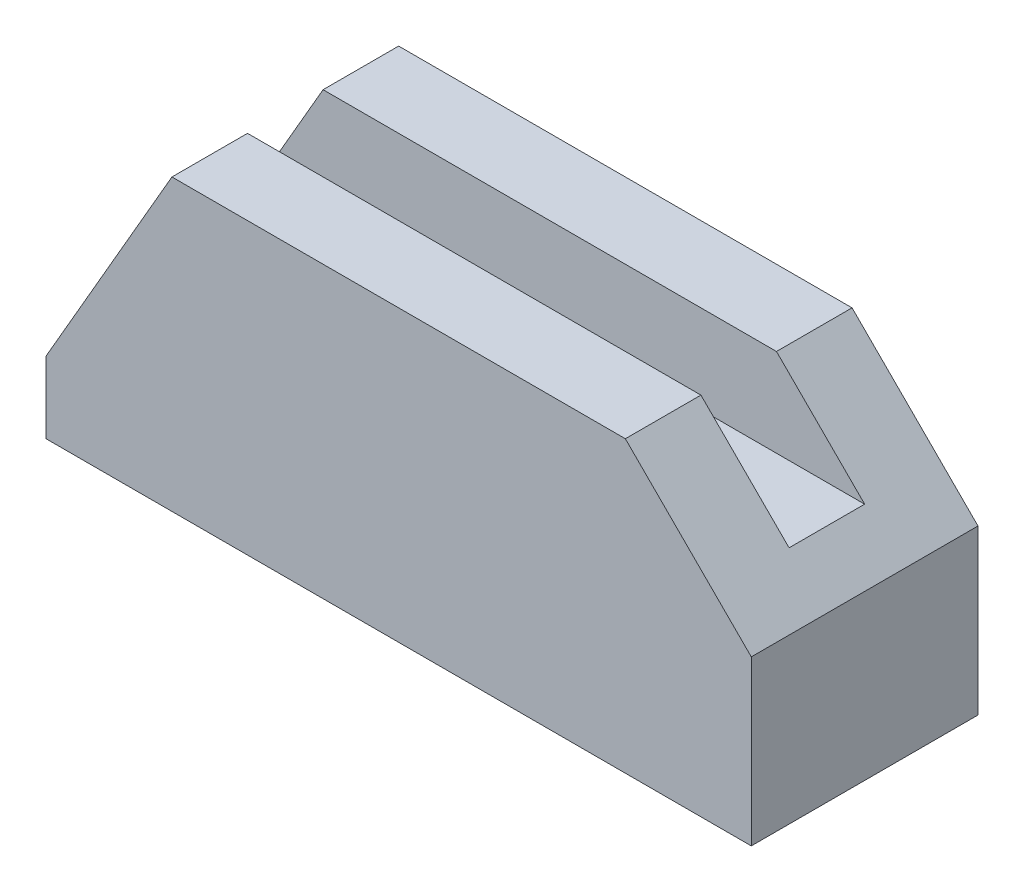
ISO-10303-21;
HEADER;
FILE_DESCRIPTION(('STEP AP214'),'2;1');
FILE_NAME('part.step','',(''),(''),'','','');
FILE_SCHEMA(('AUTOMOTIVE_DESIGN { 1 0 10303 214 1 1 1 1 }'));
ENDSEC;
DATA;
#1=APPLICATION_CONTEXT('core data for automotive mechanical design processes');
#2=APPLICATION_PROTOCOL_DEFINITION('international standard','automotive_design',2000,#1);
#3=PRODUCT_CONTEXT('',#1,'mechanical');
#4=PRODUCT('Part','Part','',(#3));
#5=PRODUCT_RELATED_PRODUCT_CATEGORY('part','',(#4));
#6=PRODUCT_DEFINITION_FORMATION('','',#4);
#7=PRODUCT_DEFINITION_CONTEXT('part definition',#1,'design');
#8=PRODUCT_DEFINITION('design','',#6,#7);
#9=PRODUCT_DEFINITION_SHAPE('','',#8);
#10=(LENGTH_UNIT() NAMED_UNIT(*) SI_UNIT(.MILLI.,.METRE.));
#11=(NAMED_UNIT(*) PLANE_ANGLE_UNIT() SI_UNIT($,.RADIAN.));
#12=(NAMED_UNIT(*) SI_UNIT($,.STERADIAN.) SOLID_ANGLE_UNIT());
#13=UNCERTAINTY_MEASURE_WITH_UNIT(LENGTH_MEASURE(1.E-05),#10,'distance_accuracy_value','');
#14=(GEOMETRIC_REPRESENTATION_CONTEXT(3) GLOBAL_UNCERTAINTY_ASSIGNED_CONTEXT((#13)) GLOBAL_UNIT_ASSIGNED_CONTEXT((#10,
#11,#12)) REPRESENTATION_CONTEXT('',''));
#15=CARTESIAN_POINT('',(0.,0.,0.));
#16=DIRECTION('',(0.,0.,1.));
#17=DIRECTION('',(1.,0.,0.));
#18=AXIS2_PLACEMENT_3D('',#15,#16,#17);
#19=CARTESIAN_POINT('',(18.,23.,9.));
#20=DIRECTION('',(0.,-1.,0.));
#21=DIRECTION('',(0.,0.,-1.));
#22=AXIS2_PLACEMENT_3D('',#19,#20,#21);
#23=PLANE('',#22);
#24=DIRECTION('',(0.,0.,-1.));
#25=VECTOR('',#24,1.);
#26=CARTESIAN_POINT('',(18.,23.,9.));
#27=LINE('',#26,#25);
#28=CARTESIAN_POINT('',(18.,23.,9.));
#29=VERTEX_POINT('',#28);
#30=CARTESIAN_POINT('',(18.,23.,3.));
#31=VERTEX_POINT('',#30);
#32=EDGE_CURVE('E115',#29,#31,#27,.T.);
#33=ORIENTED_EDGE('',*,*,#32,.T.);
#34=DIRECTION('',(1.,0.,0.));
#35=VECTOR('',#34,1.);
#36=CARTESIAN_POINT('',(-103.379438338777,23.,3.));
#37=LINE('',#36,#35);
#38=CARTESIAN_POINT('',(-18.,23.,3.));
#39=VERTEX_POINT('',#38);
#40=EDGE_CURVE('E201',#39,#31,#37,.T.);
#41=ORIENTED_EDGE('',*,*,#40,.F.);
#42=DIRECTION('',(0.,0.,-1.));
#43=VECTOR('',#42,1.);
#44=CARTESIAN_POINT('',(-18.,23.,9.));
#45=LINE('',#44,#43);
#46=CARTESIAN_POINT('',(-18.,23.,9.));
#47=VERTEX_POINT('',#46);
#48=EDGE_CURVE('E127',#47,#39,#45,.T.);
#49=ORIENTED_EDGE('',*,*,#48,.F.);
#50=DIRECTION('',(-1.,0.,0.));
#51=VECTOR('',#50,1.);
#52=CARTESIAN_POINT('',(18.,23.,9.));
#53=LINE('',#52,#51);
#54=EDGE_CURVE('E105',#29,#47,#53,.T.);
#55=ORIENTED_EDGE('',*,*,#54,.F.);
#56=EDGE_LOOP('',(#33,#41,#49,#55));
#57=FACE_BOUND('',#56,.T.);
#58=ADVANCED_FACE('F33',(#57),#23,.F.);
#59=CARTESIAN_POINT('',(-28.,5.67949192431123,9.));
#60=DIRECTION('',(1.,0.,0.));
#61=DIRECTION('',(0.,0.,-1.));
#62=AXIS2_PLACEMENT_3D('',#59,#60,#61);
#63=PLANE('',#62);
#64=DIRECTION('',(0.,-1.,0.));
#65=VECTOR('',#64,1.);
#66=CARTESIAN_POINT('',(-28.,5.67949192431123,-9.));
#67=LINE('',#66,#65);
#68=CARTESIAN_POINT('',(-28.,5.67949192431123,-9.));
#69=VERTEX_POINT('',#68);
#70=CARTESIAN_POINT('',(-28.,0.,-9.));
#71=VERTEX_POINT('',#70);
#72=EDGE_CURVE('E133',#69,#71,#67,.T.);
#73=ORIENTED_EDGE('',*,*,#72,.T.);
#74=DIRECTION('',(0.,0.,-1.));
#75=VECTOR('',#74,1.);
#76=CARTESIAN_POINT('',(-28.,0.,9.));
#77=LINE('',#76,#75);
#78=CARTESIAN_POINT('',(-28.,0.,9.));
#79=VERTEX_POINT('',#78);
#80=EDGE_CURVE('E155',#79,#71,#77,.T.);
#81=ORIENTED_EDGE('',*,*,#80,.F.);
#82=DIRECTION('',(0.,-1.,0.));
#83=VECTOR('',#82,1.);
#84=CARTESIAN_POINT('',(-28.,5.67949192431123,9.));
#85=LINE('',#84,#83);
#86=CARTESIAN_POINT('',(-28.,5.67949192431123,9.));
#87=VERTEX_POINT('',#86);
#88=EDGE_CURVE('E147',#87,#79,#85,.T.);
#89=ORIENTED_EDGE('',*,*,#88,.F.);
#90=DIRECTION('',(0.,0.,-1.));
#91=VECTOR('',#90,1.);
#92=CARTESIAN_POINT('',(-28.,5.67949192431123,9.));
#93=LINE('',#92,#91);
#94=EDGE_CURVE('E129',#87,#69,#93,.T.);
#95=ORIENTED_EDGE('',*,*,#94,.T.);
#96=EDGE_LOOP('',(#73,#81,#89,#95));
#97=FACE_BOUND('',#96,.T.);
#98=ADVANCED_FACE('F35',(#97),#63,.F.);
#99=CARTESIAN_POINT('',(-28.,0.,9.));
#100=DIRECTION('',(0.,1.,0.));
#101=DIRECTION('',(-1.,0.,0.));
#102=AXIS2_PLACEMENT_3D('',#99,#100,#101);
#103=PLANE('',#102);
#104=DIRECTION('',(1.,0.,0.));
#105=VECTOR('',#104,1.);
#106=CARTESIAN_POINT('',(-28.,0.,-9.));
#107=LINE('',#106,#105);
#108=CARTESIAN_POINT('',(28.,0.,-9.));
#109=VERTEX_POINT('',#108);
#110=EDGE_CURVE('E136',#71,#109,#107,.T.);
#111=ORIENTED_EDGE('',*,*,#110,.T.);
#112=DIRECTION('',(0.,0.,-1.));
#113=VECTOR('',#112,1.);
#114=CARTESIAN_POINT('',(28.,0.,9.));
#115=LINE('',#114,#113);
#116=CARTESIAN_POINT('',(28.,0.,9.));
#117=VERTEX_POINT('',#116);
#118=EDGE_CURVE('E152',#117,#109,#115,.T.);
#119=ORIENTED_EDGE('',*,*,#118,.F.);
#120=DIRECTION('',(1.,0.,0.));
#121=VECTOR('',#120,1.);
#122=CARTESIAN_POINT('',(-28.,0.,9.));
#123=LINE('',#122,#121);
#124=EDGE_CURVE('E92',#79,#117,#123,.T.);
#125=ORIENTED_EDGE('',*,*,#124,.F.);
#126=ORIENTED_EDGE('',*,*,#80,.T.);
#127=EDGE_LOOP('',(#111,#119,#125,#126));
#128=FACE_BOUND('',#127,.T.);
#129=ADVANCED_FACE('F208',(#128),#103,.F.);
#130=CARTESIAN_POINT('',(28.,0.,9.));
#131=DIRECTION('',(-1.,0.,0.));
#132=DIRECTION('',(0.,-1.,0.));
#133=AXIS2_PLACEMENT_3D('',#130,#131,#132);
#134=PLANE('',#133);
#135=DIRECTION('',(0.,1.,0.));
#136=VECTOR('',#135,1.);
#137=CARTESIAN_POINT('',(28.,0.,-9.));
#138=LINE('',#137,#136);
#139=CARTESIAN_POINT('',(28.,13.,-9.));
#140=VERTEX_POINT('',#139);
#141=EDGE_CURVE('E138',#109,#140,#138,.T.);
#142=ORIENTED_EDGE('',*,*,#141,.T.);
#143=DIRECTION('',(0.,0.,-1.));
#144=VECTOR('',#143,1.);
#145=CARTESIAN_POINT('',(28.,13.,9.));
#146=LINE('',#145,#144);
#147=CARTESIAN_POINT('',(28.,13.,9.));
#148=VERTEX_POINT('',#147);
#149=EDGE_CURVE('E123',#148,#140,#146,.T.);
#150=ORIENTED_EDGE('',*,*,#149,.F.);
#151=DIRECTION('',(0.,1.,0.));
#152=VECTOR('',#151,1.);
#153=CARTESIAN_POINT('',(28.,0.,9.));
#154=LINE('',#153,#152);
#155=EDGE_CURVE('E108',#117,#148,#154,.T.);
#156=ORIENTED_EDGE('',*,*,#155,.F.);
#157=ORIENTED_EDGE('',*,*,#118,.T.);
#158=EDGE_LOOP('',(#142,#150,#156,#157));
#159=FACE_BOUND('',#158,.T.);
#160=ADVANCED_FACE('F210',(#159),#134,.F.);
#161=CARTESIAN_POINT('',(28.,13.,9.));
#162=DIRECTION('',(-0.707106781186546,-0.707106781186549,0.));
#163=DIRECTION('',(0.707106781186549,-0.707106781186546,0.));
#164=AXIS2_PLACEMENT_3D('',#161,#162,#163);
#165=PLANE('',#164);
#166=DIRECTION('',(0.,0.,-1.));
#167=VECTOR('',#166,1.);
#168=CARTESIAN_POINT('',(25.,16.,9.));
#169=LINE('',#168,#167);
#170=CARTESIAN_POINT('',(25.,16.,3.));
#171=VERTEX_POINT('',#170);
#172=CARTESIAN_POINT('',(25.,16.,-3.));
#173=VERTEX_POINT('',#172);
#174=EDGE_CURVE('E193',#171,#173,#169,.T.);
#175=ORIENTED_EDGE('',*,*,#174,.F.);
#176=DIRECTION('',(-0.707106781186549,0.707106781186546,0.));
#177=VECTOR('',#176,1.);
#178=CARTESIAN_POINT('',(28.,13.,3.));
#179=LINE('',#178,#177);
#180=EDGE_CURVE('E120',#171,#31,#179,.T.);
#181=ORIENTED_EDGE('',*,*,#180,.T.);
#182=ORIENTED_EDGE('',*,*,#32,.F.);
#183=DIRECTION('',(-0.707106781186549,0.707106781186546,0.));
#184=VECTOR('',#183,1.);
#185=CARTESIAN_POINT('',(28.,13.,9.));
#186=LINE('',#185,#184);
#187=EDGE_CURVE('E101',#148,#29,#186,.T.);
#188=ORIENTED_EDGE('',*,*,#187,.F.);
#189=ORIENTED_EDGE('',*,*,#149,.T.);
#190=DIRECTION('',(-0.707106781186549,0.707106781186546,0.));
#191=VECTOR('',#190,1.);
#192=CARTESIAN_POINT('',(28.,13.,-9.));
#193=LINE('',#192,#191);
#194=CARTESIAN_POINT('',(18.,23.,-9.));
#195=VERTEX_POINT('',#194);
#196=EDGE_CURVE('E140',#140,#195,#193,.T.);
#197=ORIENTED_EDGE('',*,*,#196,.T.);
#198=CARTESIAN_POINT('',(18.,23.,-3.));
#199=VERTEX_POINT('',#198);
#200=EDGE_CURVE('E124',#199,#195,#27,.T.);
#201=ORIENTED_EDGE('',*,*,#200,.F.);
#202=DIRECTION('',(0.707106781186549,-0.707106781186546,0.));
#203=VECTOR('',#202,1.);
#204=CARTESIAN_POINT('',(28.,13.,-3.));
#205=LINE('',#204,#203);
#206=EDGE_CURVE('E197',#199,#173,#205,.T.);
#207=ORIENTED_EDGE('',*,*,#206,.T.);
#208=EDGE_LOOP('',(#175,#181,#182,#188,#189,#197,#201,#207));
#209=FACE_BOUND('',#208,.T.);
#210=ADVANCED_FACE('F117',(#209),#165,.F.);
#211=CARTESIAN_POINT('',(-18.,23.,-3.));
#212=VERTEX_POINT('',#211);
#213=CARTESIAN_POINT('',(-18.,23.,-9.));
#214=VERTEX_POINT('',#213);
#215=EDGE_CURVE('E149',#212,#214,#45,.T.);
#216=ORIENTED_EDGE('',*,*,#215,.F.);
#217=DIRECTION('',(-1.,0.,0.));
#218=VECTOR('',#217,1.);
#219=CARTESIAN_POINT('',(-103.379438338777,23.,-3.));
#220=LINE('',#219,#218);
#221=EDGE_CURVE('E171',#199,#212,#220,.T.);
#222=ORIENTED_EDGE('',*,*,#221,.F.);
#223=ORIENTED_EDGE('',*,*,#200,.T.);
#224=DIRECTION('',(-1.,0.,0.));
#225=VECTOR('',#224,1.);
#226=CARTESIAN_POINT('',(18.,23.,-9.));
#227=LINE('',#226,#225);
#228=EDGE_CURVE('E143',#195,#214,#227,.T.);
#229=ORIENTED_EDGE('',*,*,#228,.T.);
#230=EDGE_LOOP('',(#216,#222,#223,#229));
#231=FACE_BOUND('',#230,.T.);
#232=ADVANCED_FACE('F170',(#231),#23,.F.);
#233=CARTESIAN_POINT('',(-18.,23.,9.));
#234=DIRECTION('',(0.866025403784438,-0.500000000000001,0.));
#235=DIRECTION('',(0.500000000000001,0.866025403784438,0.));
#236=AXIS2_PLACEMENT_3D('',#233,#234,#235);
#237=PLANE('',#236);
#238=ORIENTED_EDGE('',*,*,#48,.T.);
#239=DIRECTION('',(-0.500000000000001,-0.866025403784438,0.));
#240=VECTOR('',#239,1.);
#241=CARTESIAN_POINT('',(-18.,23.,3.));
#242=LINE('',#241,#240);
#243=CARTESIAN_POINT('',(-22.0414518843274,16.,3.));
#244=VERTEX_POINT('',#243);
#245=EDGE_CURVE('E11',#39,#244,#242,.T.);
#246=ORIENTED_EDGE('',*,*,#245,.T.);
#247=DIRECTION('',(0.,0.,1.));
#248=VECTOR('',#247,1.);
#249=CARTESIAN_POINT('',(-22.0414518843274,16.,9.));
#250=LINE('',#249,#248);
#251=CARTESIAN_POINT('',(-22.0414518843274,16.,-3.));
#252=VERTEX_POINT('',#251);
#253=EDGE_CURVE('E157',#252,#244,#250,.T.);
#254=ORIENTED_EDGE('',*,*,#253,.F.);
#255=DIRECTION('',(0.500000000000001,0.866025403784438,0.));
#256=VECTOR('',#255,1.);
#257=CARTESIAN_POINT('',(-18.,23.,-3.));
#258=LINE('',#257,#256);
#259=EDGE_CURVE('E41',#252,#212,#258,.T.);
#260=ORIENTED_EDGE('',*,*,#259,.T.);
#261=ORIENTED_EDGE('',*,*,#215,.T.);
#262=DIRECTION('',(-0.500000000000001,-0.866025403784438,0.));
#263=VECTOR('',#262,1.);
#264=CARTESIAN_POINT('',(-18.,23.,-9.));
#265=LINE('',#264,#263);
#266=EDGE_CURVE('E83',#214,#69,#265,.T.);
#267=ORIENTED_EDGE('',*,*,#266,.T.);
#268=ORIENTED_EDGE('',*,*,#94,.F.);
#269=DIRECTION('',(-0.500000000000001,-0.866025403784438,0.));
#270=VECTOR('',#269,1.);
#271=CARTESIAN_POINT('',(-18.,23.,9.));
#272=LINE('',#271,#270);
#273=EDGE_CURVE('E57',#47,#87,#272,.T.);
#274=ORIENTED_EDGE('',*,*,#273,.F.);
#275=EDGE_LOOP('',(#238,#246,#254,#260,#261,#267,#268,#274));
#276=FACE_BOUND('',#275,.T.);
#277=ADVANCED_FACE('F162',(#276),#237,.F.);
#278=CARTESIAN_POINT('',(0.,0.,9.));
#279=DIRECTION('',(0.,0.,1.));
#280=DIRECTION('',(1.,0.,0.));
#281=AXIS2_PLACEMENT_3D('',#278,#279,#280);
#282=PLANE('',#281);
#283=ORIENTED_EDGE('',*,*,#88,.T.);
#284=ORIENTED_EDGE('',*,*,#124,.T.);
#285=ORIENTED_EDGE('',*,*,#155,.T.);
#286=ORIENTED_EDGE('',*,*,#187,.T.);
#287=ORIENTED_EDGE('',*,*,#54,.T.);
#288=ORIENTED_EDGE('',*,*,#273,.T.);
#289=EDGE_LOOP('',(#283,#284,#285,#286,#287,#288));
#290=FACE_BOUND('',#289,.T.);
#291=ADVANCED_FACE('F103',(#290),#282,.T.);
#292=CARTESIAN_POINT('',(0.,0.,-9.));
#293=DIRECTION('',(0.,0.,1.));
#294=DIRECTION('',(1.,0.,0.));
#295=AXIS2_PLACEMENT_3D('',#292,#293,#294);
#296=PLANE('',#295);
#297=ORIENTED_EDGE('',*,*,#72,.F.);
#298=ORIENTED_EDGE('',*,*,#266,.F.);
#299=ORIENTED_EDGE('',*,*,#228,.F.);
#300=ORIENTED_EDGE('',*,*,#196,.F.);
#301=ORIENTED_EDGE('',*,*,#141,.F.);
#302=ORIENTED_EDGE('',*,*,#110,.F.);
#303=EDGE_LOOP('',(#297,#298,#299,#300,#301,#302));
#304=FACE_BOUND('',#303,.T.);
#305=ADVANCED_FACE('F177',(#304),#296,.F.);
#306=CARTESIAN_POINT('',(-103.379438338777,16.,3.));
#307=DIRECTION('',(0.,0.,1.));
#308=DIRECTION('',(1.,0.,0.));
#309=AXIS2_PLACEMENT_3D('',#306,#307,#308);
#310=PLANE('',#309);
#311=DIRECTION('',(1.,0.,0.));
#312=VECTOR('',#311,1.);
#313=CARTESIAN_POINT('',(-103.379438338777,16.,3.));
#314=LINE('',#313,#312);
#315=EDGE_CURVE('E195',#244,#171,#314,.T.);
#316=ORIENTED_EDGE('',*,*,#315,.F.);
#317=ORIENTED_EDGE('',*,*,#245,.F.);
#318=ORIENTED_EDGE('',*,*,#40,.T.);
#319=ORIENTED_EDGE('',*,*,#180,.F.);
#320=EDGE_LOOP('',(#316,#317,#318,#319));
#321=FACE_BOUND('',#320,.T.);
#322=ADVANCED_FACE('F234',(#321),#310,.F.);
#323=CARTESIAN_POINT('',(-103.379438338777,16.,-3.));
#324=DIRECTION('',(0.,0.,-1.));
#325=DIRECTION('',(-1.,0.,0.));
#326=AXIS2_PLACEMENT_3D('',#323,#324,#325);
#327=PLANE('',#326);
#328=ORIENTED_EDGE('',*,*,#221,.T.);
#329=ORIENTED_EDGE('',*,*,#259,.F.);
#330=DIRECTION('',(-1.,0.,0.));
#331=VECTOR('',#330,1.);
#332=CARTESIAN_POINT('',(-103.379438338777,16.,-3.));
#333=LINE('',#332,#331);
#334=EDGE_CURVE('E48',#173,#252,#333,.T.);
#335=ORIENTED_EDGE('',*,*,#334,.F.);
#336=ORIENTED_EDGE('',*,*,#206,.F.);
#337=EDGE_LOOP('',(#328,#329,#335,#336));
#338=FACE_BOUND('',#337,.T.);
#339=ADVANCED_FACE('F200',(#338),#327,.F.);
#340=CARTESIAN_POINT('',(0.,16.,0.));
#341=DIRECTION('',(0.,1.,0.));
#342=DIRECTION('',(0.,0.,1.));
#343=AXIS2_PLACEMENT_3D('',#340,#341,#342);
#344=PLANE('',#343);
#345=ORIENTED_EDGE('',*,*,#174,.T.);
#346=ORIENTED_EDGE('',*,*,#334,.T.);
#347=ORIENTED_EDGE('',*,*,#253,.T.);
#348=ORIENTED_EDGE('',*,*,#315,.T.);
#349=EDGE_LOOP('',(#345,#346,#347,#348));
#350=FACE_BOUND('',#349,.T.);
#351=ADVANCED_FACE('F194',(#350),#344,.T.);
#352=CLOSED_SHELL('',(#58,#98,#129,#160,#210,#232,#277,#291,#305,#322,#339,#351));
#353=MANIFOLD_SOLID_BREP('B2',#352);
#354=ADVANCED_BREP_SHAPE_REPRESENTATION('',(#18,#353),#14);
#355=SHAPE_DEFINITION_REPRESENTATION(#9,#354);
ENDSEC;
END-ISO-10303-21;
